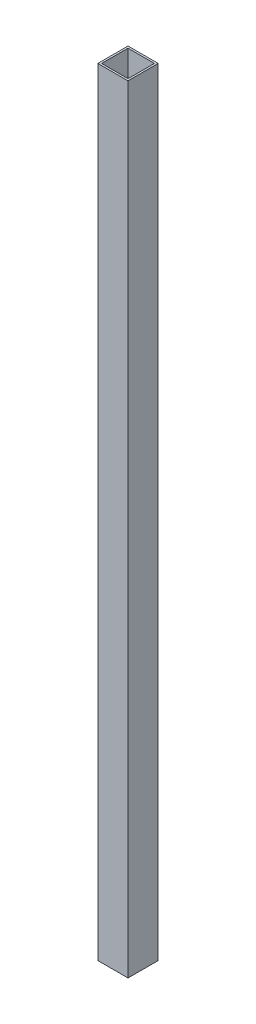
ISO-10303-21;
HEADER;
FILE_DESCRIPTION(('STEP AP214'),'2;1');
FILE_NAME('part.step','',(''),(''),'','','');
FILE_SCHEMA(('AUTOMOTIVE_DESIGN { 1 0 10303 214 1 1 1 1 }'));
ENDSEC;
DATA;
#1=APPLICATION_CONTEXT('core data for automotive mechanical design processes');
#2=APPLICATION_PROTOCOL_DEFINITION('international standard','automotive_design',2000,#1);
#3=PRODUCT_CONTEXT('',#1,'mechanical');
#4=PRODUCT('Part','Part','',(#3));
#5=PRODUCT_RELATED_PRODUCT_CATEGORY('part','',(#4));
#6=PRODUCT_DEFINITION_FORMATION('','',#4);
#7=PRODUCT_DEFINITION_CONTEXT('part definition',#1,'design');
#8=PRODUCT_DEFINITION('design','',#6,#7);
#9=PRODUCT_DEFINITION_SHAPE('','',#8);
#10=(LENGTH_UNIT() NAMED_UNIT(*) SI_UNIT(.MILLI.,.METRE.));
#11=(NAMED_UNIT(*) PLANE_ANGLE_UNIT() SI_UNIT($,.RADIAN.));
#12=(NAMED_UNIT(*) SI_UNIT($,.STERADIAN.) SOLID_ANGLE_UNIT());
#13=UNCERTAINTY_MEASURE_WITH_UNIT(LENGTH_MEASURE(1.E-05),#10,'distance_accuracy_value','');
#14=(GEOMETRIC_REPRESENTATION_CONTEXT(3) GLOBAL_UNCERTAINTY_ASSIGNED_CONTEXT((#13)) GLOBAL_UNIT_ASSIGNED_CONTEXT((#10,
#11,#12)) REPRESENTATION_CONTEXT('',''));
#15=CARTESIAN_POINT('',(0.,0.,0.));
#16=DIRECTION('',(0.,0.,1.));
#17=DIRECTION('',(1.,0.,0.));
#18=AXIS2_PLACEMENT_3D('',#15,#16,#17);
#19=CARTESIAN_POINT('',(0.,654.05,0.));
#20=DIRECTION('',(0.,-1.,0.));
#21=DIRECTION('',(0.,0.,-1.));
#22=AXIS2_PLACEMENT_3D('',#19,#20,#21);
#23=PLANE('',#22);
#24=DIRECTION('',(0.,0.,-1.));
#25=VECTOR('',#24,1.);
#26=CARTESIAN_POINT('',(12.7,654.05,12.7));
#27=LINE('',#26,#25);
#28=CARTESIAN_POINT('',(12.7,654.05,12.7));
#29=VERTEX_POINT('',#28);
#30=CARTESIAN_POINT('',(12.7,654.05,-12.7));
#31=VERTEX_POINT('',#30);
#32=EDGE_CURVE('E133',#29,#31,#27,.T.);
#33=ORIENTED_EDGE('',*,*,#32,.T.);
#34=DIRECTION('',(-1.,0.,0.));
#35=VECTOR('',#34,1.);
#36=CARTESIAN_POINT('',(-12.7,654.05,-12.7));
#37=LINE('',#36,#35);
#38=CARTESIAN_POINT('',(-12.7,654.05,-12.7));
#39=VERTEX_POINT('',#38);
#40=EDGE_CURVE('E136',#31,#39,#37,.T.);
#41=ORIENTED_EDGE('',*,*,#40,.T.);
#42=DIRECTION('',(0.,0.,1.));
#43=VECTOR('',#42,1.);
#44=CARTESIAN_POINT('',(-12.7,654.05,12.7));
#45=LINE('',#44,#43);
#46=CARTESIAN_POINT('',(-12.7,654.05,12.7));
#47=VERTEX_POINT('',#46);
#48=EDGE_CURVE('E139',#39,#47,#45,.T.);
#49=ORIENTED_EDGE('',*,*,#48,.T.);
#50=DIRECTION('',(1.,0.,0.));
#51=VECTOR('',#50,1.);
#52=CARTESIAN_POINT('',(-12.7,654.05,12.7));
#53=LINE('',#52,#51);
#54=EDGE_CURVE('E141',#47,#29,#53,.T.);
#55=ORIENTED_EDGE('',*,*,#54,.T.);
#56=EDGE_LOOP('',(#33,#41,#49,#55));
#57=FACE_BOUND('',#56,.T.);
#58=DIRECTION('',(0.,0.,-1.));
#59=VECTOR('',#58,1.);
#60=CARTESIAN_POINT('',(11.1125,654.05,11.1125));
#61=LINE('',#60,#59);
#62=CARTESIAN_POINT('',(11.1125,654.05,11.1125));
#63=VERTEX_POINT('',#62);
#64=CARTESIAN_POINT('',(11.1125,654.05,-11.1125));
#65=VERTEX_POINT('',#64);
#66=EDGE_CURVE('E97',#63,#65,#61,.T.);
#67=ORIENTED_EDGE('',*,*,#66,.F.);
#68=DIRECTION('',(1.,0.,0.));
#69=VECTOR('',#68,1.);
#70=CARTESIAN_POINT('',(-11.1125,654.05,11.1125));
#71=LINE('',#70,#69);
#72=CARTESIAN_POINT('',(-11.1125,654.05,11.1125));
#73=VERTEX_POINT('',#72);
#74=EDGE_CURVE('E119',#73,#63,#71,.T.);
#75=ORIENTED_EDGE('',*,*,#74,.F.);
#76=DIRECTION('',(0.,0.,1.));
#77=VECTOR('',#76,1.);
#78=CARTESIAN_POINT('',(-11.1125,654.05,11.1125));
#79=LINE('',#78,#77);
#80=CARTESIAN_POINT('',(-11.1125,654.05,-11.1125));
#81=VERTEX_POINT('',#80);
#82=EDGE_CURVE('E117',#81,#73,#79,.T.);
#83=ORIENTED_EDGE('',*,*,#82,.F.);
#84=DIRECTION('',(-1.,0.,0.));
#85=VECTOR('',#84,1.);
#86=CARTESIAN_POINT('',(-11.1125,654.05,-11.1125));
#87=LINE('',#86,#85);
#88=EDGE_CURVE('E105',#65,#81,#87,.T.);
#89=ORIENTED_EDGE('',*,*,#88,.F.);
#90=EDGE_LOOP('',(#67,#75,#83,#89));
#91=FACE_BOUND('',#90,.T.);
#92=ADVANCED_FACE('F32',(#57,#91),#23,.F.);
#93=CARTESIAN_POINT('',(0.,0.,0.));
#94=DIRECTION('',(0.,-1.,0.));
#95=DIRECTION('',(0.,0.,-1.));
#96=AXIS2_PLACEMENT_3D('',#93,#94,#95);
#97=PLANE('',#96);
#98=DIRECTION('',(0.,0.,-1.));
#99=VECTOR('',#98,1.);
#100=CARTESIAN_POINT('',(12.7,0.,12.7));
#101=LINE('',#100,#99);
#102=CARTESIAN_POINT('',(12.7,0.,12.7));
#103=VERTEX_POINT('',#102);
#104=CARTESIAN_POINT('',(12.7,0.,-12.7));
#105=VERTEX_POINT('',#104);
#106=EDGE_CURVE('E113',#103,#105,#101,.T.);
#107=ORIENTED_EDGE('',*,*,#106,.F.);
#108=DIRECTION('',(1.,0.,0.));
#109=VECTOR('',#108,1.);
#110=CARTESIAN_POINT('',(-12.7,0.,12.7));
#111=LINE('',#110,#109);
#112=CARTESIAN_POINT('',(-12.7,0.,12.7));
#113=VERTEX_POINT('',#112);
#114=EDGE_CURVE('E137',#113,#103,#111,.T.);
#115=ORIENTED_EDGE('',*,*,#114,.F.);
#116=DIRECTION('',(0.,0.,1.));
#117=VECTOR('',#116,1.);
#118=CARTESIAN_POINT('',(-12.7,0.,12.7));
#119=LINE('',#118,#117);
#120=CARTESIAN_POINT('',(-12.7,0.,-12.7));
#121=VERTEX_POINT('',#120);
#122=EDGE_CURVE('E148',#121,#113,#119,.T.);
#123=ORIENTED_EDGE('',*,*,#122,.F.);
#124=DIRECTION('',(-1.,0.,0.));
#125=VECTOR('',#124,1.);
#126=CARTESIAN_POINT('',(-12.7,0.,-12.7));
#127=LINE('',#126,#125);
#128=EDGE_CURVE('E146',#105,#121,#127,.T.);
#129=ORIENTED_EDGE('',*,*,#128,.F.);
#130=EDGE_LOOP('',(#107,#115,#123,#129));
#131=FACE_BOUND('',#130,.T.);
#132=DIRECTION('',(1.,0.,0.));
#133=VECTOR('',#132,1.);
#134=CARTESIAN_POINT('',(-11.1125,0.,11.1125));
#135=LINE('',#134,#133);
#136=CARTESIAN_POINT('',(-11.1125,0.,11.1125));
#137=VERTEX_POINT('',#136);
#138=CARTESIAN_POINT('',(11.1125,0.,11.1125));
#139=VERTEX_POINT('',#138);
#140=EDGE_CURVE('E106',#137,#139,#135,.T.);
#141=ORIENTED_EDGE('',*,*,#140,.T.);
#142=DIRECTION('',(0.,0.,-1.));
#143=VECTOR('',#142,1.);
#144=CARTESIAN_POINT('',(11.1125,0.,11.1125));
#145=LINE('',#144,#143);
#146=CARTESIAN_POINT('',(11.1125,0.,-11.1125));
#147=VERTEX_POINT('',#146);
#148=EDGE_CURVE('E55',#139,#147,#145,.T.);
#149=ORIENTED_EDGE('',*,*,#148,.T.);
#150=DIRECTION('',(-1.,0.,0.));
#151=VECTOR('',#150,1.);
#152=CARTESIAN_POINT('',(-11.1125,0.,-11.1125));
#153=LINE('',#152,#151);
#154=CARTESIAN_POINT('',(-11.1125,0.,-11.1125));
#155=VERTEX_POINT('',#154);
#156=EDGE_CURVE('E112',#147,#155,#153,.T.);
#157=ORIENTED_EDGE('',*,*,#156,.T.);
#158=DIRECTION('',(0.,0.,1.));
#159=VECTOR('',#158,1.);
#160=CARTESIAN_POINT('',(-11.1125,0.,11.1125));
#161=LINE('',#160,#159);
#162=EDGE_CURVE('E125',#155,#137,#161,.T.);
#163=ORIENTED_EDGE('',*,*,#162,.T.);
#164=EDGE_LOOP('',(#141,#149,#157,#163));
#165=FACE_BOUND('',#164,.T.);
#166=ADVANCED_FACE('F166',(#131,#165),#97,.T.);
#167=CARTESIAN_POINT('',(12.7,654.05,12.7));
#168=DIRECTION('',(-1.,0.,0.));
#169=DIRECTION('',(0.,0.,1.));
#170=AXIS2_PLACEMENT_3D('',#167,#168,#169);
#171=PLANE('',#170);
#172=ORIENTED_EDGE('',*,*,#106,.T.);
#173=DIRECTION('',(0.,-1.,0.));
#174=VECTOR('',#173,1.);
#175=CARTESIAN_POINT('',(12.7,654.05,-12.7));
#176=LINE('',#175,#174);
#177=EDGE_CURVE('E11',#31,#105,#176,.T.);
#178=ORIENTED_EDGE('',*,*,#177,.F.);
#179=ORIENTED_EDGE('',*,*,#32,.F.);
#180=DIRECTION('',(0.,-1.,0.));
#181=VECTOR('',#180,1.);
#182=CARTESIAN_POINT('',(12.7,654.05,12.7));
#183=LINE('',#182,#181);
#184=EDGE_CURVE('E143',#29,#103,#183,.T.);
#185=ORIENTED_EDGE('',*,*,#184,.T.);
#186=EDGE_LOOP('',(#172,#178,#179,#185));
#187=FACE_BOUND('',#186,.T.);
#188=ADVANCED_FACE('F34',(#187),#171,.F.);
#189=CARTESIAN_POINT('',(-12.7,654.05,-12.7));
#190=DIRECTION('',(0.,0.,1.));
#191=DIRECTION('',(1.,0.,0.));
#192=AXIS2_PLACEMENT_3D('',#189,#190,#191);
#193=PLANE('',#192);
#194=ORIENTED_EDGE('',*,*,#128,.T.);
#195=DIRECTION('',(0.,-1.,0.));
#196=VECTOR('',#195,1.);
#197=CARTESIAN_POINT('',(-12.7,654.05,-12.7));
#198=LINE('',#197,#196);
#199=EDGE_CURVE('E40',#39,#121,#198,.T.);
#200=ORIENTED_EDGE('',*,*,#199,.F.);
#201=ORIENTED_EDGE('',*,*,#40,.F.);
#202=ORIENTED_EDGE('',*,*,#177,.T.);
#203=EDGE_LOOP('',(#194,#200,#201,#202));
#204=FACE_BOUND('',#203,.T.);
#205=ADVANCED_FACE('F176',(#204),#193,.F.);
#206=CARTESIAN_POINT('',(-12.7,654.05,12.7));
#207=DIRECTION('',(1.,0.,0.));
#208=DIRECTION('',(0.,0.,-1.));
#209=AXIS2_PLACEMENT_3D('',#206,#207,#208);
#210=PLANE('',#209);
#211=ORIENTED_EDGE('',*,*,#122,.T.);
#212=DIRECTION('',(0.,-1.,0.));
#213=VECTOR('',#212,1.);
#214=CARTESIAN_POINT('',(-12.7,654.05,12.7));
#215=LINE('',#214,#213);
#216=EDGE_CURVE('E153',#47,#113,#215,.T.);
#217=ORIENTED_EDGE('',*,*,#216,.F.);
#218=ORIENTED_EDGE('',*,*,#48,.F.);
#219=ORIENTED_EDGE('',*,*,#199,.T.);
#220=EDGE_LOOP('',(#211,#217,#218,#219));
#221=FACE_BOUND('',#220,.T.);
#222=ADVANCED_FACE('F160',(#221),#210,.F.);
#223=CARTESIAN_POINT('',(-12.7,654.05,12.7));
#224=DIRECTION('',(0.,0.,-1.));
#225=DIRECTION('',(-1.,0.,0.));
#226=AXIS2_PLACEMENT_3D('',#223,#224,#225);
#227=PLANE('',#226);
#228=ORIENTED_EDGE('',*,*,#114,.T.);
#229=ORIENTED_EDGE('',*,*,#184,.F.);
#230=ORIENTED_EDGE('',*,*,#54,.F.);
#231=ORIENTED_EDGE('',*,*,#216,.T.);
#232=EDGE_LOOP('',(#228,#229,#230,#231));
#233=FACE_BOUND('',#232,.T.);
#234=ADVANCED_FACE('F170',(#233),#227,.F.);
#235=CARTESIAN_POINT('',(11.1125,654.05,11.1125));
#236=DIRECTION('',(-1.,0.,0.));
#237=DIRECTION('',(0.,0.,1.));
#238=AXIS2_PLACEMENT_3D('',#235,#236,#237);
#239=PLANE('',#238);
#240=ORIENTED_EDGE('',*,*,#148,.F.);
#241=DIRECTION('',(0.,-1.,0.));
#242=VECTOR('',#241,1.);
#243=CARTESIAN_POINT('',(11.1125,654.05,11.1125));
#244=LINE('',#243,#242);
#245=EDGE_CURVE('E101',#63,#139,#244,.T.);
#246=ORIENTED_EDGE('',*,*,#245,.F.);
#247=ORIENTED_EDGE('',*,*,#66,.T.);
#248=DIRECTION('',(0.,-1.,0.));
#249=VECTOR('',#248,1.);
#250=CARTESIAN_POINT('',(11.1125,654.05,-11.1125));
#251=LINE('',#250,#249);
#252=EDGE_CURVE('E100',#65,#147,#251,.T.);
#253=ORIENTED_EDGE('',*,*,#252,.T.);
#254=EDGE_LOOP('',(#240,#246,#247,#253));
#255=FACE_BOUND('',#254,.T.);
#256=ADVANCED_FACE('F99',(#255),#239,.T.);
#257=CARTESIAN_POINT('',(-11.1125,654.05,-11.1125));
#258=DIRECTION('',(0.,0.,1.));
#259=DIRECTION('',(1.,0.,0.));
#260=AXIS2_PLACEMENT_3D('',#257,#258,#259);
#261=PLANE('',#260);
#262=ORIENTED_EDGE('',*,*,#156,.F.);
#263=ORIENTED_EDGE('',*,*,#252,.F.);
#264=ORIENTED_EDGE('',*,*,#88,.T.);
#265=DIRECTION('',(0.,-1.,0.));
#266=VECTOR('',#265,1.);
#267=CARTESIAN_POINT('',(-11.1125,654.05,-11.1125));
#268=LINE('',#267,#266);
#269=EDGE_CURVE('E114',#81,#155,#268,.T.);
#270=ORIENTED_EDGE('',*,*,#269,.T.);
#271=EDGE_LOOP('',(#262,#263,#264,#270));
#272=FACE_BOUND('',#271,.T.);
#273=ADVANCED_FACE('F109',(#272),#261,.T.);
#274=CARTESIAN_POINT('',(-11.1125,654.05,11.1125));
#275=DIRECTION('',(1.,0.,0.));
#276=DIRECTION('',(0.,0.,-1.));
#277=AXIS2_PLACEMENT_3D('',#274,#275,#276);
#278=PLANE('',#277);
#279=ORIENTED_EDGE('',*,*,#162,.F.);
#280=ORIENTED_EDGE('',*,*,#269,.F.);
#281=ORIENTED_EDGE('',*,*,#82,.T.);
#282=DIRECTION('',(0.,-1.,0.));
#283=VECTOR('',#282,1.);
#284=CARTESIAN_POINT('',(-11.1125,654.05,11.1125));
#285=LINE('',#284,#283);
#286=EDGE_CURVE('E47',#73,#137,#285,.T.);
#287=ORIENTED_EDGE('',*,*,#286,.T.);
#288=EDGE_LOOP('',(#279,#280,#281,#287));
#289=FACE_BOUND('',#288,.T.);
#290=ADVANCED_FACE('F199',(#289),#278,.T.);
#291=CARTESIAN_POINT('',(-11.1125,654.05,11.1125));
#292=DIRECTION('',(0.,0.,-1.));
#293=DIRECTION('',(-1.,0.,0.));
#294=AXIS2_PLACEMENT_3D('',#291,#292,#293);
#295=PLANE('',#294);
#296=ORIENTED_EDGE('',*,*,#140,.F.);
#297=ORIENTED_EDGE('',*,*,#286,.F.);
#298=ORIENTED_EDGE('',*,*,#74,.T.);
#299=ORIENTED_EDGE('',*,*,#245,.T.);
#300=EDGE_LOOP('',(#296,#297,#298,#299));
#301=FACE_BOUND('',#300,.T.);
#302=ADVANCED_FACE('F203',(#301),#295,.T.);
#303=CLOSED_SHELL('',(#92,#166,#188,#205,#222,#234,#256,#273,#290,#302));
#304=MANIFOLD_SOLID_BREP('B2',#303);
#305=ADVANCED_BREP_SHAPE_REPRESENTATION('',(#18,#304),#14);
#306=SHAPE_DEFINITION_REPRESENTATION(#9,#305);
ENDSEC;
END-ISO-10303-21;
